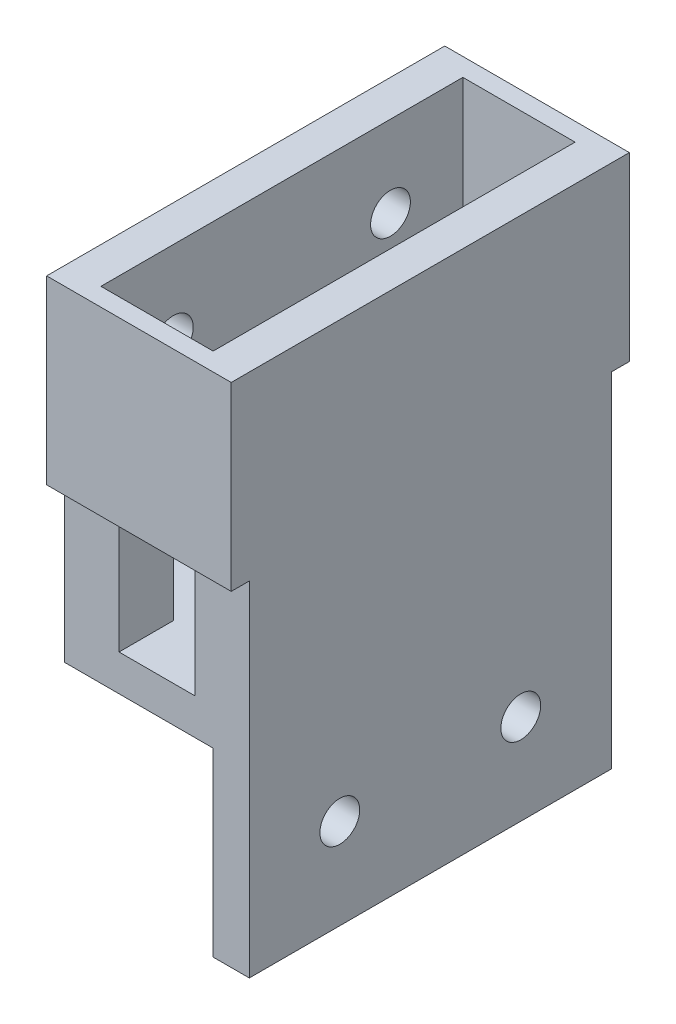
ISO-10303-21;
HEADER;
FILE_DESCRIPTION(('STEP AP214'),'2;1');
FILE_NAME('part.step','',(''),(''),'','','');
FILE_SCHEMA(('AUTOMOTIVE_DESIGN { 1 0 10303 214 1 1 1 1 }'));
ENDSEC;
DATA;
#1=APPLICATION_CONTEXT('core data for automotive mechanical design processes');
#2=APPLICATION_PROTOCOL_DEFINITION('international standard','automotive_design',2000,#1);
#3=PRODUCT_CONTEXT('',#1,'mechanical');
#4=PRODUCT('Part','Part','',(#3));
#5=PRODUCT_RELATED_PRODUCT_CATEGORY('part','',(#4));
#6=PRODUCT_DEFINITION_FORMATION('','',#4);
#7=PRODUCT_DEFINITION_CONTEXT('part definition',#1,'design');
#8=PRODUCT_DEFINITION('design','',#6,#7);
#9=PRODUCT_DEFINITION_SHAPE('','',#8);
#10=(LENGTH_UNIT() NAMED_UNIT(*) SI_UNIT(.MILLI.,.METRE.));
#11=(NAMED_UNIT(*) PLANE_ANGLE_UNIT() SI_UNIT($,.RADIAN.));
#12=(NAMED_UNIT(*) SI_UNIT($,.STERADIAN.) SOLID_ANGLE_UNIT());
#13=UNCERTAINTY_MEASURE_WITH_UNIT(LENGTH_MEASURE(1.E-05),#10,'distance_accuracy_value','');
#14=(GEOMETRIC_REPRESENTATION_CONTEXT(3) GLOBAL_UNCERTAINTY_ASSIGNED_CONTEXT((#13)) GLOBAL_UNIT_ASSIGNED_CONTEXT((#10,
#11,#12)) REPRESENTATION_CONTEXT('',''));
#15=CARTESIAN_POINT('',(0.,0.,0.));
#16=DIRECTION('',(0.,0.,1.));
#17=DIRECTION('',(1.,0.,0.));
#18=AXIS2_PLACEMENT_3D('',#15,#16,#17);
#19=CARTESIAN_POINT('',(0.,0.,20.));
#20=DIRECTION('',(0.,0.,1.));
#21=DIRECTION('',(1.,0.,0.));
#22=AXIS2_PLACEMENT_3D('',#19,#20,#21);
#23=PLANE('',#22);
#24=DIRECTION('',(0.,1.,0.));
#25=VECTOR('',#24,1.);
#26=CARTESIAN_POINT('',(10.2,-6.,20.));
#27=LINE('',#26,#25);
#28=CARTESIAN_POINT('',(10.2,-18.,20.));
#29=VERTEX_POINT('',#28);
#30=CARTESIAN_POINT('',(10.2,0.999999999999999,20.));
#31=VERTEX_POINT('',#30);
#32=EDGE_CURVE('E211',#29,#31,#27,.T.);
#33=ORIENTED_EDGE('',*,*,#32,.T.);
#34=DIRECTION('',(-1.,0.,0.));
#35=VECTOR('',#34,1.);
#36=CARTESIAN_POINT('',(10.2,0.999999999999999,20.));
#37=LINE('',#36,#35);
#38=CARTESIAN_POINT('',(7.2,0.999999999999999,20.));
#39=VERTEX_POINT('',#38);
#40=EDGE_CURVE('E48',#31,#39,#37,.T.);
#41=ORIENTED_EDGE('',*,*,#40,.T.);
#42=DIRECTION('',(0.,-1.,0.));
#43=VECTOR('',#42,1.);
#44=CARTESIAN_POINT('',(7.2,-6.,20.));
#45=LINE('',#44,#43);
#46=CARTESIAN_POINT('',(7.2,-6.,20.));
#47=VERTEX_POINT('',#46);
#48=EDGE_CURVE('E228',#39,#47,#45,.T.);
#49=ORIENTED_EDGE('',*,*,#48,.T.);
#50=DIRECTION('',(-1.,0.,0.));
#51=VECTOR('',#50,1.);
#52=CARTESIAN_POINT('',(3.,-6.,20.));
#53=LINE('',#52,#51);
#54=CARTESIAN_POINT('',(3.,-6.,20.));
#55=VERTEX_POINT('',#54);
#56=EDGE_CURVE('E231',#47,#55,#53,.T.);
#57=ORIENTED_EDGE('',*,*,#56,.T.);
#58=DIRECTION('',(0.,1.,0.));
#59=VECTOR('',#58,1.);
#60=CARTESIAN_POINT('',(3.,2.,20.));
#61=LINE('',#60,#59);
#62=CARTESIAN_POINT('',(3.,0.999999999999999,20.));
#63=VERTEX_POINT('',#62);
#64=EDGE_CURVE('E234',#55,#63,#61,.T.);
#65=ORIENTED_EDGE('',*,*,#64,.T.);
#66=CARTESIAN_POINT('',(0.,0.999999999999999,20.));
#67=VERTEX_POINT('',#66);
#68=EDGE_CURVE('E11',#63,#67,#37,.T.);
#69=ORIENTED_EDGE('',*,*,#68,.T.);
#70=DIRECTION('',(0.,-1.,0.));
#71=VECTOR('',#70,1.);
#72=CARTESIAN_POINT('',(0.,11.,20.));
#73=LINE('',#72,#71);
#74=CARTESIAN_POINT('',(0.,-8.,20.));
#75=VERTEX_POINT('',#74);
#76=EDGE_CURVE('E241',#67,#75,#73,.T.);
#77=ORIENTED_EDGE('',*,*,#76,.T.);
#78=DIRECTION('',(1.,0.,0.));
#79=VECTOR('',#78,1.);
#80=CARTESIAN_POINT('',(0.,-8.,20.));
#81=LINE('',#80,#79);
#82=CARTESIAN_POINT('',(8.2,-8.,20.));
#83=VERTEX_POINT('',#82);
#84=EDGE_CURVE('E280',#75,#83,#81,.T.);
#85=ORIENTED_EDGE('',*,*,#84,.T.);
#86=DIRECTION('',(0.,-1.,0.));
#87=VECTOR('',#86,1.);
#88=CARTESIAN_POINT('',(8.2,-18.,20.));
#89=LINE('',#88,#87);
#90=CARTESIAN_POINT('',(8.2,-18.,20.));
#91=VERTEX_POINT('',#90);
#92=EDGE_CURVE('E223',#83,#91,#89,.T.);
#93=ORIENTED_EDGE('',*,*,#92,.T.);
#94=DIRECTION('',(1.,0.,0.));
#95=VECTOR('',#94,1.);
#96=CARTESIAN_POINT('',(10.2,-18.,20.));
#97=LINE('',#96,#95);
#98=EDGE_CURVE('E217',#91,#29,#97,.T.);
#99=ORIENTED_EDGE('',*,*,#98,.T.);
#100=EDGE_LOOP('',(#33,#41,#49,#57,#65,#69,#77,#85,#93,#99));
#101=FACE_BOUND('',#100,.T.);
#102=ADVANCED_FACE('F37',(#101),#23,.T.);
#103=CARTESIAN_POINT('',(0.,-8.,20.));
#104=DIRECTION('',(0.,1.,0.));
#105=DIRECTION('',(0.,0.,1.));
#106=AXIS2_PLACEMENT_3D('',#103,#104,#105);
#107=PLANE('',#106);
#108=DIRECTION('',(1.,0.,0.));
#109=VECTOR('',#108,1.);
#110=CARTESIAN_POINT('',(0.,-8.,0.));
#111=LINE('',#110,#109);
#112=CARTESIAN_POINT('',(0.,-8.,0.));
#113=VERTEX_POINT('',#112);
#114=CARTESIAN_POINT('',(8.2,-8.,0.));
#115=VERTEX_POINT('',#114);
#116=EDGE_CURVE('E244',#113,#115,#111,.T.);
#117=ORIENTED_EDGE('',*,*,#116,.T.);
#118=DIRECTION('',(0.,0.,-1.));
#119=VECTOR('',#118,1.);
#120=CARTESIAN_POINT('',(8.2,-8.,20.));
#121=LINE('',#120,#119);
#122=EDGE_CURVE('E317',#83,#115,#121,.T.);
#123=ORIENTED_EDGE('',*,*,#122,.F.);
#124=ORIENTED_EDGE('',*,*,#84,.F.);
#125=DIRECTION('',(0.,0.,-1.));
#126=VECTOR('',#125,1.);
#127=CARTESIAN_POINT('',(0.,-8.,20.));
#128=LINE('',#127,#126);
#129=EDGE_CURVE('E243',#75,#113,#128,.T.);
#130=ORIENTED_EDGE('',*,*,#129,.T.);
#131=EDGE_LOOP('',(#117,#123,#124,#130));
#132=FACE_BOUND('',#131,.T.);
#133=ADVANCED_FACE('F39',(#132),#107,.F.);
#134=CARTESIAN_POINT('',(8.2,-18.,20.));
#135=DIRECTION('',(1.,0.,0.));
#136=DIRECTION('',(0.,0.,-1.));
#137=AXIS2_PLACEMENT_3D('',#134,#135,#136);
#138=PLANE('',#137);
#139=CARTESIAN_POINT('',(8.2,-13.,15.));
#140=DIRECTION('',(-1.,0.,0.));
#141=DIRECTION('',(0.,0.,1.));
#142=AXIS2_PLACEMENT_3D('',#139,#140,#141);
#143=CIRCLE('',#142,1.1);
#144=CARTESIAN_POINT('',(8.2,-13.,16.1));
#145=VERTEX_POINT('',#144);
#146=EDGE_CURVE('E333',#145,#145,#143,.T.);
#147=ORIENTED_EDGE('',*,*,#146,.F.);
#148=EDGE_LOOP('',(#147));
#149=FACE_BOUND('',#148,.T.);
#150=CARTESIAN_POINT('',(8.2,-13.,5.));
#151=DIRECTION('',(-1.,0.,0.));
#152=DIRECTION('',(0.,0.,1.));
#153=AXIS2_PLACEMENT_3D('',#150,#151,#152);
#154=CIRCLE('',#153,1.1);
#155=CARTESIAN_POINT('',(8.2,-13.,6.1));
#156=VERTEX_POINT('',#155);
#157=EDGE_CURVE('E322',#156,#156,#154,.T.);
#158=ORIENTED_EDGE('',*,*,#157,.F.);
#159=EDGE_LOOP('',(#158));
#160=FACE_BOUND('',#159,.T.);
#161=DIRECTION('',(0.,-1.,0.));
#162=VECTOR('',#161,1.);
#163=CARTESIAN_POINT('',(8.2,-18.,0.));
#164=LINE('',#163,#162);
#165=CARTESIAN_POINT('',(8.2,-18.,0.));
#166=VERTEX_POINT('',#165);
#167=EDGE_CURVE('E247',#115,#166,#164,.T.);
#168=ORIENTED_EDGE('',*,*,#167,.T.);
#169=DIRECTION('',(0.,0.,-1.));
#170=VECTOR('',#169,1.);
#171=CARTESIAN_POINT('',(8.2,-18.,20.));
#172=LINE('',#171,#170);
#173=EDGE_CURVE('E314',#91,#166,#172,.T.);
#174=ORIENTED_EDGE('',*,*,#173,.F.);
#175=ORIENTED_EDGE('',*,*,#92,.F.);
#176=ORIENTED_EDGE('',*,*,#122,.T.);
#177=EDGE_LOOP('',(#168,#174,#175,#176));
#178=FACE_BOUND('',#177,.T.);
#179=ADVANCED_FACE('F412',(#149,#160,#178),#138,.F.);
#180=CARTESIAN_POINT('',(10.2,-18.,20.));
#181=DIRECTION('',(0.,1.,0.));
#182=DIRECTION('',(0.,0.,1.));
#183=AXIS2_PLACEMENT_3D('',#180,#181,#182);
#184=PLANE('',#183);
#185=DIRECTION('',(1.,0.,0.));
#186=VECTOR('',#185,1.);
#187=CARTESIAN_POINT('',(10.2,-18.,0.));
#188=LINE('',#187,#186);
#189=CARTESIAN_POINT('',(10.2,-18.,0.));
#190=VERTEX_POINT('',#189);
#191=EDGE_CURVE('E250',#166,#190,#188,.T.);
#192=ORIENTED_EDGE('',*,*,#191,.T.);
#193=DIRECTION('',(0.,0.,-1.));
#194=VECTOR('',#193,1.);
#195=CARTESIAN_POINT('',(10.2,-18.,20.));
#196=LINE('',#195,#194);
#197=EDGE_CURVE('E312',#29,#190,#196,.T.);
#198=ORIENTED_EDGE('',*,*,#197,.F.);
#199=ORIENTED_EDGE('',*,*,#98,.F.);
#200=ORIENTED_EDGE('',*,*,#173,.T.);
#201=EDGE_LOOP('',(#192,#198,#199,#200));
#202=FACE_BOUND('',#201,.T.);
#203=ADVANCED_FACE('F415',(#202),#184,.F.);
#204=CARTESIAN_POINT('',(10.2,11.,20.));
#205=DIRECTION('',(-1.,0.,0.));
#206=DIRECTION('',(0.,-1.,0.));
#207=AXIS2_PLACEMENT_3D('',#204,#205,#206);
#208=PLANE('',#207);
#209=CARTESIAN_POINT('',(10.2,-13.,15.));
#210=DIRECTION('',(-1.,0.,0.));
#211=DIRECTION('',(0.,-1.,0.));
#212=AXIS2_PLACEMENT_3D('',#209,#210,#211);
#213=CIRCLE('',#212,1.1);
#214=CARTESIAN_POINT('',(10.2,-14.1,15.));
#215=VERTEX_POINT('',#214);
#216=EDGE_CURVE('E41',#215,#215,#213,.T.);
#217=ORIENTED_EDGE('',*,*,#216,.T.);
#218=EDGE_LOOP('',(#217));
#219=FACE_BOUND('',#218,.T.);
#220=CARTESIAN_POINT('',(10.2,-13.,5.));
#221=DIRECTION('',(-1.,0.,0.));
#222=DIRECTION('',(0.,-1.,0.));
#223=AXIS2_PLACEMENT_3D('',#220,#221,#222);
#224=CIRCLE('',#223,1.1);
#225=CARTESIAN_POINT('',(10.2,-14.1,5.));
#226=VERTEX_POINT('',#225);
#227=EDGE_CURVE('E319',#226,#226,#224,.T.);
#228=ORIENTED_EDGE('',*,*,#227,.T.);
#229=EDGE_LOOP('',(#228));
#230=FACE_BOUND('',#229,.T.);
#231=DIRECTION('',(0.,1.,0.));
#232=VECTOR('',#231,1.);
#233=CARTESIAN_POINT('',(10.2,11.,0.));
#234=LINE('',#233,#232);
#235=CARTESIAN_POINT('',(10.2,0.999999999999999,0.));
#236=VERTEX_POINT('',#235);
#237=EDGE_CURVE('E253',#190,#236,#234,.T.);
#238=ORIENTED_EDGE('',*,*,#237,.T.);
#239=DIRECTION('',(0.,0.,-1.));
#240=VECTOR('',#239,1.);
#241=CARTESIAN_POINT('',(10.2,0.999999999999999,0.));
#242=LINE('',#241,#240);
#243=CARTESIAN_POINT('',(10.2,0.999999999999999,-1.));
#244=VERTEX_POINT('',#243);
#245=EDGE_CURVE('E365',#236,#244,#242,.T.);
#246=ORIENTED_EDGE('',*,*,#245,.T.);
#247=DIRECTION('',(0.,1.,0.));
#248=VECTOR('',#247,1.);
#249=CARTESIAN_POINT('',(10.2,0.999999999999999,-1.));
#250=LINE('',#249,#248);
#251=CARTESIAN_POINT('',(10.2,11.,-1.));
#252=VERTEX_POINT('',#251);
#253=EDGE_CURVE('E371',#244,#252,#250,.T.);
#254=ORIENTED_EDGE('',*,*,#253,.T.);
#255=DIRECTION('',(0.,0.,-1.));
#256=VECTOR('',#255,1.);
#257=CARTESIAN_POINT('',(10.2,11.,20.));
#258=LINE('',#257,#256);
#259=CARTESIAN_POINT('',(10.2,11.,21.));
#260=VERTEX_POINT('',#259);
#261=EDGE_CURVE('E310',#260,#252,#258,.T.);
#262=ORIENTED_EDGE('',*,*,#261,.F.);
#263=DIRECTION('',(0.,1.,0.));
#264=VECTOR('',#263,1.);
#265=CARTESIAN_POINT('',(10.2,0.999999999999999,21.));
#266=LINE('',#265,#264);
#267=CARTESIAN_POINT('',(10.2,0.999999999999999,21.));
#268=VERTEX_POINT('',#267);
#269=EDGE_CURVE('E213',#268,#260,#266,.T.);
#270=ORIENTED_EDGE('',*,*,#269,.F.);
#271=DIRECTION('',(0.,0.,-1.));
#272=VECTOR('',#271,1.);
#273=CARTESIAN_POINT('',(10.2,0.999999999999999,21.));
#274=LINE('',#273,#272);
#275=EDGE_CURVE('E201',#268,#31,#274,.T.);
#276=ORIENTED_EDGE('',*,*,#275,.T.);
#277=ORIENTED_EDGE('',*,*,#32,.F.);
#278=ORIENTED_EDGE('',*,*,#197,.T.);
#279=EDGE_LOOP('',(#238,#246,#254,#262,#270,#276,#277,#278));
#280=FACE_BOUND('',#279,.T.);
#281=ADVANCED_FACE('F209',(#219,#230,#280),#208,.F.);
#282=CARTESIAN_POINT('',(8.2,2.,20.));
#283=DIRECTION('',(1.,0.,0.));
#284=DIRECTION('',(0.,0.,-1.));
#285=AXIS2_PLACEMENT_3D('',#282,#283,#284);
#286=PLANE('',#285);
#287=DIRECTION('',(0.,-1.,0.));
#288=VECTOR('',#287,1.);
#289=CARTESIAN_POINT('',(8.2,2.,0.));
#290=LINE('',#289,#288);
#291=CARTESIAN_POINT('',(8.2,11.,0.));
#292=VERTEX_POINT('',#291);
#293=CARTESIAN_POINT('',(8.2,2.,0.));
#294=VERTEX_POINT('',#293);
#295=EDGE_CURVE('E255',#292,#294,#290,.T.);
#296=ORIENTED_EDGE('',*,*,#295,.T.);
#297=DIRECTION('',(0.,0.,-1.));
#298=VECTOR('',#297,1.);
#299=CARTESIAN_POINT('',(8.2,2.,20.));
#300=LINE('',#299,#298);
#301=CARTESIAN_POINT('',(8.2,2.,20.));
#302=VERTEX_POINT('',#301);
#303=EDGE_CURVE('E304',#302,#294,#300,.T.);
#304=ORIENTED_EDGE('',*,*,#303,.F.);
#305=DIRECTION('',(0.,-1.,0.));
#306=VECTOR('',#305,1.);
#307=CARTESIAN_POINT('',(8.2,2.,20.));
#308=LINE('',#307,#306);
#309=CARTESIAN_POINT('',(8.2,11.,20.));
#310=VERTEX_POINT('',#309);
#311=EDGE_CURVE('E219',#310,#302,#308,.T.);
#312=ORIENTED_EDGE('',*,*,#311,.F.);
#313=DIRECTION('',(0.,0.,-1.));
#314=VECTOR('',#313,1.);
#315=CARTESIAN_POINT('',(8.2,11.,20.));
#316=LINE('',#315,#314);
#317=EDGE_CURVE('E307',#310,#292,#316,.T.);
#318=ORIENTED_EDGE('',*,*,#317,.T.);
#319=EDGE_LOOP('',(#296,#304,#312,#318));
#320=FACE_BOUND('',#319,.T.);
#321=ADVANCED_FACE('F461',(#320),#286,.F.);
#322=CARTESIAN_POINT('',(7.2,2.,20.));
#323=DIRECTION('',(0.,-1.,0.));
#324=DIRECTION('',(0.,0.,-1.));
#325=AXIS2_PLACEMENT_3D('',#322,#323,#324);
#326=PLANE('',#325);
#327=DIRECTION('',(-1.,0.,0.));
#328=VECTOR('',#327,1.);
#329=CARTESIAN_POINT('',(7.2,2.,0.));
#330=LINE('',#329,#328);
#331=CARTESIAN_POINT('',(7.2,2.,0.));
#332=VERTEX_POINT('',#331);
#333=EDGE_CURVE('E258',#294,#332,#330,.T.);
#334=ORIENTED_EDGE('',*,*,#333,.T.);
#335=DIRECTION('',(0.,0.,-1.));
#336=VECTOR('',#335,1.);
#337=CARTESIAN_POINT('',(7.2,2.,20.));
#338=LINE('',#337,#336);
#339=CARTESIAN_POINT('',(7.2,2.,20.));
#340=VERTEX_POINT('',#339);
#341=EDGE_CURVE('E301',#340,#332,#338,.T.);
#342=ORIENTED_EDGE('',*,*,#341,.F.);
#343=DIRECTION('',(-1.,0.,0.));
#344=VECTOR('',#343,1.);
#345=CARTESIAN_POINT('',(7.2,2.,20.));
#346=LINE('',#345,#344);
#347=EDGE_CURVE('E221',#302,#340,#346,.T.);
#348=ORIENTED_EDGE('',*,*,#347,.F.);
#349=ORIENTED_EDGE('',*,*,#303,.T.);
#350=EDGE_LOOP('',(#334,#342,#348,#349));
#351=FACE_BOUND('',#350,.T.);
#352=ADVANCED_FACE('F466',(#351),#326,.F.);
#353=CARTESIAN_POINT('',(7.2,-6.,20.));
#354=DIRECTION('',(1.,0.,0.));
#355=DIRECTION('',(0.,0.,-1.));
#356=AXIS2_PLACEMENT_3D('',#353,#354,#355);
#357=PLANE('',#356);
#358=DIRECTION('',(0.,-1.,0.));
#359=VECTOR('',#358,1.);
#360=CARTESIAN_POINT('',(7.2,-6.,0.));
#361=LINE('',#360,#359);
#362=CARTESIAN_POINT('',(7.2,0.999999999999999,0.));
#363=VERTEX_POINT('',#362);
#364=EDGE_CURVE('E262',#332,#363,#361,.T.);
#365=ORIENTED_EDGE('',*,*,#364,.T.);
#366=CARTESIAN_POINT('',(7.2,-6.,0.));
#367=VERTEX_POINT('',#366);
#368=EDGE_CURVE('E261',#363,#367,#361,.T.);
#369=ORIENTED_EDGE('',*,*,#368,.T.);
#370=DIRECTION('',(0.,0.,-1.));
#371=VECTOR('',#370,1.);
#372=CARTESIAN_POINT('',(7.2,-6.,20.));
#373=LINE('',#372,#371);
#374=EDGE_CURVE('E298',#47,#367,#373,.T.);
#375=ORIENTED_EDGE('',*,*,#374,.F.);
#376=ORIENTED_EDGE('',*,*,#48,.F.);
#377=EDGE_CURVE('E229',#340,#39,#45,.T.);
#378=ORIENTED_EDGE('',*,*,#377,.F.);
#379=ORIENTED_EDGE('',*,*,#341,.T.);
#380=EDGE_LOOP('',(#365,#369,#375,#376,#378,#379));
#381=FACE_BOUND('',#380,.T.);
#382=ADVANCED_FACE('F468',(#381),#357,.F.);
#383=CARTESIAN_POINT('',(3.,-6.,20.));
#384=DIRECTION('',(0.,-1.,0.));
#385=DIRECTION('',(0.,0.,-1.));
#386=AXIS2_PLACEMENT_3D('',#383,#384,#385);
#387=PLANE('',#386);
#388=DIRECTION('',(-1.,0.,0.));
#389=VECTOR('',#388,1.);
#390=CARTESIAN_POINT('',(3.,-6.,0.));
#391=LINE('',#390,#389);
#392=CARTESIAN_POINT('',(3.,-6.,0.));
#393=VERTEX_POINT('',#392);
#394=EDGE_CURVE('E265',#367,#393,#391,.T.);
#395=ORIENTED_EDGE('',*,*,#394,.T.);
#396=DIRECTION('',(0.,0.,-1.));
#397=VECTOR('',#396,1.);
#398=CARTESIAN_POINT('',(3.,-6.,20.));
#399=LINE('',#398,#397);
#400=CARTESIAN_POINT('',(3.,-6.,3.));
#401=VERTEX_POINT('',#400);
#402=EDGE_CURVE('E294',#401,#393,#399,.T.);
#403=ORIENTED_EDGE('',*,*,#402,.F.);
#404=DIRECTION('',(-1.,0.,0.));
#405=VECTOR('',#404,1.);
#406=CARTESIAN_POINT('',(17.560219778561,-6.,3.));
#407=LINE('',#406,#405);
#408=CARTESIAN_POINT('',(0.,-6.,3.));
#409=VERTEX_POINT('',#408);
#410=EDGE_CURVE('E399',#401,#409,#407,.T.);
#411=ORIENTED_EDGE('',*,*,#410,.T.);
#412=DIRECTION('',(0.,0.,1.));
#413=VECTOR('',#412,1.);
#414=CARTESIAN_POINT('',(0.,-6.,3.));
#415=LINE('',#414,#413);
#416=CARTESIAN_POINT('',(0.,-6.,17.));
#417=VERTEX_POINT('',#416);
#418=EDGE_CURVE('E390',#409,#417,#415,.T.);
#419=ORIENTED_EDGE('',*,*,#418,.T.);
#420=DIRECTION('',(-1.,0.,0.));
#421=VECTOR('',#420,1.);
#422=CARTESIAN_POINT('',(17.560219778561,-6.,17.));
#423=LINE('',#422,#421);
#424=CARTESIAN_POINT('',(3.,-6.,17.));
#425=VERTEX_POINT('',#424);
#426=EDGE_CURVE('E403',#425,#417,#423,.T.);
#427=ORIENTED_EDGE('',*,*,#426,.F.);
#428=EDGE_CURVE('E295',#55,#425,#399,.T.);
#429=ORIENTED_EDGE('',*,*,#428,.F.);
#430=ORIENTED_EDGE('',*,*,#56,.F.);
#431=ORIENTED_EDGE('',*,*,#374,.T.);
#432=EDGE_LOOP('',(#395,#403,#411,#419,#427,#429,#430,#431));
#433=FACE_BOUND('',#432,.T.);
#434=ADVANCED_FACE('F473',(#433),#387,.F.);
#435=CARTESIAN_POINT('',(3.,2.,20.));
#436=DIRECTION('',(-1.,0.,0.));
#437=DIRECTION('',(0.,0.,1.));
#438=AXIS2_PLACEMENT_3D('',#435,#436,#437);
#439=PLANE('',#438);
#440=DIRECTION('',(0.,0.,1.));
#441=VECTOR('',#440,1.);
#442=CARTESIAN_POINT('',(3.,-2.,3.));
#443=LINE('',#442,#441);
#444=CARTESIAN_POINT('',(3.,-2.,3.));
#445=VERTEX_POINT('',#444);
#446=CARTESIAN_POINT('',(3.,-2.,17.));
#447=VERTEX_POINT('',#446);
#448=EDGE_CURVE('E385',#445,#447,#443,.T.);
#449=ORIENTED_EDGE('',*,*,#448,.F.);
#450=DIRECTION('',(0.,1.,0.));
#451=VECTOR('',#450,1.);
#452=CARTESIAN_POINT('',(3.,-6.,3.));
#453=LINE('',#452,#451);
#454=EDGE_CURVE('E248',#401,#445,#453,.T.);
#455=ORIENTED_EDGE('',*,*,#454,.F.);
#456=ORIENTED_EDGE('',*,*,#402,.T.);
#457=DIRECTION('',(0.,1.,0.));
#458=VECTOR('',#457,1.);
#459=CARTESIAN_POINT('',(3.,2.,0.));
#460=LINE('',#459,#458);
#461=CARTESIAN_POINT('',(3.,0.999999999999999,0.));
#462=VERTEX_POINT('',#461);
#463=EDGE_CURVE('E269',#393,#462,#460,.T.);
#464=ORIENTED_EDGE('',*,*,#463,.T.);
#465=CARTESIAN_POINT('',(3.,2.,0.));
#466=VERTEX_POINT('',#465);
#467=EDGE_CURVE('E268',#462,#466,#460,.T.);
#468=ORIENTED_EDGE('',*,*,#467,.T.);
#469=DIRECTION('',(0.,0.,-1.));
#470=VECTOR('',#469,1.);
#471=CARTESIAN_POINT('',(3.,2.,20.));
#472=LINE('',#471,#470);
#473=CARTESIAN_POINT('',(3.,2.,20.));
#474=VERTEX_POINT('',#473);
#475=EDGE_CURVE('E291',#474,#466,#472,.T.);
#476=ORIENTED_EDGE('',*,*,#475,.F.);
#477=EDGE_CURVE('E233',#63,#474,#61,.T.);
#478=ORIENTED_EDGE('',*,*,#477,.F.);
#479=ORIENTED_EDGE('',*,*,#64,.F.);
#480=ORIENTED_EDGE('',*,*,#428,.T.);
#481=DIRECTION('',(0.,-1.,0.));
#482=VECTOR('',#481,1.);
#483=CARTESIAN_POINT('',(3.,-6.,17.));
#484=LINE('',#483,#482);
#485=EDGE_CURVE('E382',#447,#425,#484,.T.);
#486=ORIENTED_EDGE('',*,*,#485,.F.);
#487=EDGE_LOOP('',(#449,#455,#456,#464,#468,#476,#478,#479,#480,#486));
#488=FACE_BOUND('',#487,.T.);
#489=ADVANCED_FACE('F446',(#488),#439,.F.);
#490=CARTESIAN_POINT('',(2.,2.,20.));
#491=DIRECTION('',(0.,-1.,0.));
#492=DIRECTION('',(0.,0.,-1.));
#493=AXIS2_PLACEMENT_3D('',#490,#491,#492);
#494=PLANE('',#493);
#495=DIRECTION('',(-1.,0.,0.));
#496=VECTOR('',#495,1.);
#497=CARTESIAN_POINT('',(2.,2.,0.));
#498=LINE('',#497,#496);
#499=CARTESIAN_POINT('',(2.,2.,0.));
#500=VERTEX_POINT('',#499);
#501=EDGE_CURVE('E272',#466,#500,#498,.T.);
#502=ORIENTED_EDGE('',*,*,#501,.T.);
#503=DIRECTION('',(0.,0.,-1.));
#504=VECTOR('',#503,1.);
#505=CARTESIAN_POINT('',(2.,2.,20.));
#506=LINE('',#505,#504);
#507=CARTESIAN_POINT('',(2.,2.,20.));
#508=VERTEX_POINT('',#507);
#509=EDGE_CURVE('E288',#508,#500,#506,.T.);
#510=ORIENTED_EDGE('',*,*,#509,.F.);
#511=DIRECTION('',(-1.,0.,0.));
#512=VECTOR('',#511,1.);
#513=CARTESIAN_POINT('',(2.,2.,20.));
#514=LINE('',#513,#512);
#515=EDGE_CURVE('E237',#474,#508,#514,.T.);
#516=ORIENTED_EDGE('',*,*,#515,.F.);
#517=ORIENTED_EDGE('',*,*,#475,.T.);
#518=EDGE_LOOP('',(#502,#510,#516,#517));
#519=FACE_BOUND('',#518,.T.);
#520=ADVANCED_FACE('F450',(#519),#494,.F.);
#521=CARTESIAN_POINT('',(2.,11.,20.));
#522=DIRECTION('',(-1.,0.,0.));
#523=DIRECTION('',(0.,-1.,0.));
#524=AXIS2_PLACEMENT_3D('',#521,#522,#523);
#525=PLANE('',#524);
#526=CARTESIAN_POINT('',(2.,6.5,16.));
#527=DIRECTION('',(-1.,0.,0.));
#528=DIRECTION('',(0.,-1.,0.));
#529=AXIS2_PLACEMENT_3D('',#526,#527,#528);
#530=CIRCLE('',#529,1.1);
#531=CARTESIAN_POINT('',(2.,5.4,16.));
#532=VERTEX_POINT('',#531);
#533=EDGE_CURVE('E326',#532,#532,#530,.T.);
#534=ORIENTED_EDGE('',*,*,#533,.T.);
#535=EDGE_LOOP('',(#534));
#536=FACE_BOUND('',#535,.T.);
#537=CARTESIAN_POINT('',(2.,6.5,4.));
#538=DIRECTION('',(-1.,0.,0.));
#539=DIRECTION('',(0.,-1.,0.));
#540=AXIS2_PLACEMENT_3D('',#537,#538,#539);
#541=CIRCLE('',#540,1.1);
#542=CARTESIAN_POINT('',(2.,5.4,4.));
#543=VERTEX_POINT('',#542);
#544=EDGE_CURVE('E341',#543,#543,#541,.T.);
#545=ORIENTED_EDGE('',*,*,#544,.T.);
#546=EDGE_LOOP('',(#545));
#547=FACE_BOUND('',#546,.T.);
#548=DIRECTION('',(0.,1.,0.));
#549=VECTOR('',#548,1.);
#550=CARTESIAN_POINT('',(2.,11.,0.));
#551=LINE('',#550,#549);
#552=CARTESIAN_POINT('',(2.,11.,0.));
#553=VERTEX_POINT('',#552);
#554=EDGE_CURVE('E275',#500,#553,#551,.T.);
#555=ORIENTED_EDGE('',*,*,#554,.T.);
#556=DIRECTION('',(0.,0.,-1.));
#557=VECTOR('',#556,1.);
#558=CARTESIAN_POINT('',(2.,11.,20.));
#559=LINE('',#558,#557);
#560=CARTESIAN_POINT('',(2.,11.,20.));
#561=VERTEX_POINT('',#560);
#562=EDGE_CURVE('E285',#561,#553,#559,.T.);
#563=ORIENTED_EDGE('',*,*,#562,.F.);
#564=DIRECTION('',(0.,1.,0.));
#565=VECTOR('',#564,1.);
#566=CARTESIAN_POINT('',(2.,11.,20.));
#567=LINE('',#566,#565);
#568=EDGE_CURVE('E239',#508,#561,#567,.T.);
#569=ORIENTED_EDGE('',*,*,#568,.F.);
#570=ORIENTED_EDGE('',*,*,#509,.T.);
#571=EDGE_LOOP('',(#555,#563,#569,#570));
#572=FACE_BOUND('',#571,.T.);
#573=ADVANCED_FACE('F459',(#536,#547,#572),#525,.F.);
#574=CARTESIAN_POINT('',(0.,11.,20.));
#575=DIRECTION('',(0.,-1.,0.));
#576=DIRECTION('',(0.,0.,-1.));
#577=AXIS2_PLACEMENT_3D('',#574,#575,#576);
#578=PLANE('',#577);
#579=ORIENTED_EDGE('',*,*,#317,.F.);
#580=DIRECTION('',(-1.,0.,0.));
#581=VECTOR('',#580,1.);
#582=CARTESIAN_POINT('',(10.2,11.,20.));
#583=LINE('',#582,#581);
#584=EDGE_CURVE('E343',#310,#561,#583,.T.);
#585=ORIENTED_EDGE('',*,*,#584,.T.);
#586=ORIENTED_EDGE('',*,*,#562,.T.);
#587=DIRECTION('',(1.,0.,0.));
#588=VECTOR('',#587,1.);
#589=CARTESIAN_POINT('',(0.,11.,0.));
#590=LINE('',#589,#588);
#591=EDGE_CURVE('E354',#553,#292,#590,.T.);
#592=ORIENTED_EDGE('',*,*,#591,.T.);
#593=EDGE_LOOP('',(#579,#585,#586,#592));
#594=FACE_BOUND('',#593,.T.);
#595=DIRECTION('',(1.,0.,0.));
#596=VECTOR('',#595,1.);
#597=CARTESIAN_POINT('',(0.,11.,21.));
#598=LINE('',#597,#596);
#599=CARTESIAN_POINT('',(0.,11.,21.));
#600=VERTEX_POINT('',#599);
#601=EDGE_CURVE('E214',#600,#260,#598,.T.);
#602=ORIENTED_EDGE('',*,*,#601,.T.);
#603=ORIENTED_EDGE('',*,*,#261,.T.);
#604=DIRECTION('',(-1.,0.,0.));
#605=VECTOR('',#604,1.);
#606=CARTESIAN_POINT('',(10.2,11.,-1.));
#607=LINE('',#606,#605);
#608=CARTESIAN_POINT('',(0.,11.,-1.));
#609=VERTEX_POINT('',#608);
#610=EDGE_CURVE('E361',#252,#609,#607,.T.);
#611=ORIENTED_EDGE('',*,*,#610,.T.);
#612=DIRECTION('',(0.,0.,-1.));
#613=VECTOR('',#612,1.);
#614=CARTESIAN_POINT('',(0.,11.,20.));
#615=LINE('',#614,#613);
#616=EDGE_CURVE('E283',#600,#609,#615,.T.);
#617=ORIENTED_EDGE('',*,*,#616,.F.);
#618=EDGE_LOOP('',(#602,#603,#611,#617));
#619=FACE_BOUND('',#618,.T.);
#620=ADVANCED_FACE('F456',(#594,#619),#578,.F.);
#621=CARTESIAN_POINT('',(0.,11.,20.));
#622=DIRECTION('',(1.,0.,0.));
#623=DIRECTION('',(0.,1.,0.));
#624=AXIS2_PLACEMENT_3D('',#621,#622,#623);
#625=PLANE('',#624);
#626=CARTESIAN_POINT('',(0.,6.5,16.));
#627=DIRECTION('',(-1.,0.,0.));
#628=DIRECTION('',(0.,-1.,0.));
#629=AXIS2_PLACEMENT_3D('',#626,#627,#628);
#630=CIRCLE('',#629,1.1);
#631=CARTESIAN_POINT('',(0.,5.4,16.));
#632=VERTEX_POINT('',#631);
#633=EDGE_CURVE('E321',#632,#632,#630,.T.);
#634=ORIENTED_EDGE('',*,*,#633,.F.);
#635=EDGE_LOOP('',(#634));
#636=FACE_BOUND('',#635,.T.);
#637=CARTESIAN_POINT('',(0.,6.5,4.));
#638=DIRECTION('',(-1.,0.,0.));
#639=DIRECTION('',(0.,-1.,0.));
#640=AXIS2_PLACEMENT_3D('',#637,#638,#639);
#641=CIRCLE('',#640,1.1);
#642=CARTESIAN_POINT('',(0.,5.4,4.));
#643=VERTEX_POINT('',#642);
#644=EDGE_CURVE('E338',#643,#643,#641,.T.);
#645=ORIENTED_EDGE('',*,*,#644,.F.);
#646=EDGE_LOOP('',(#645));
#647=FACE_BOUND('',#646,.T.);
#648=ORIENTED_EDGE('',*,*,#418,.F.);
#649=DIRECTION('',(0.,-1.,0.));
#650=VECTOR('',#649,1.);
#651=CARTESIAN_POINT('',(0.,-6.,3.));
#652=LINE('',#651,#650);
#653=CARTESIAN_POINT('',(0.,-2.,3.));
#654=VERTEX_POINT('',#653);
#655=EDGE_CURVE('E379',#654,#409,#652,.T.);
#656=ORIENTED_EDGE('',*,*,#655,.F.);
#657=DIRECTION('',(0.,0.,-1.));
#658=VECTOR('',#657,1.);
#659=CARTESIAN_POINT('',(0.,-2.,3.));
#660=LINE('',#659,#658);
#661=CARTESIAN_POINT('',(0.,-2.,17.));
#662=VERTEX_POINT('',#661);
#663=EDGE_CURVE('E396',#662,#654,#660,.T.);
#664=ORIENTED_EDGE('',*,*,#663,.F.);
#665=DIRECTION('',(0.,1.,0.));
#666=VECTOR('',#665,1.);
#667=CARTESIAN_POINT('',(0.,-6.,17.));
#668=LINE('',#667,#666);
#669=EDGE_CURVE('E393',#417,#662,#668,.T.);
#670=ORIENTED_EDGE('',*,*,#669,.F.);
#671=EDGE_LOOP('',(#648,#656,#664,#670));
#672=FACE_BOUND('',#671,.T.);
#673=ORIENTED_EDGE('',*,*,#616,.T.);
#674=DIRECTION('',(0.,1.,0.));
#675=VECTOR('',#674,1.);
#676=CARTESIAN_POINT('',(0.,0.999999999999999,-1.));
#677=LINE('',#676,#675);
#678=CARTESIAN_POINT('',(0.,0.999999999999999,-1.));
#679=VERTEX_POINT('',#678);
#680=EDGE_CURVE('E376',#679,#609,#677,.T.);
#681=ORIENTED_EDGE('',*,*,#680,.F.);
#682=DIRECTION('',(0.,0.,1.));
#683=VECTOR('',#682,1.);
#684=CARTESIAN_POINT('',(0.,0.999999999999999,-1.));
#685=LINE('',#684,#683);
#686=CARTESIAN_POINT('',(0.,0.999999999999999,0.));
#687=VERTEX_POINT('',#686);
#688=EDGE_CURVE('E357',#679,#687,#685,.T.);
#689=ORIENTED_EDGE('',*,*,#688,.T.);
#690=DIRECTION('',(0.,-1.,0.));
#691=VECTOR('',#690,1.);
#692=CARTESIAN_POINT('',(0.,11.,0.));
#693=LINE('',#692,#691);
#694=EDGE_CURVE('E278',#687,#113,#693,.T.);
#695=ORIENTED_EDGE('',*,*,#694,.T.);
#696=ORIENTED_EDGE('',*,*,#129,.F.);
#697=ORIENTED_EDGE('',*,*,#76,.F.);
#698=DIRECTION('',(0.,0.,1.));
#699=VECTOR('',#698,1.);
#700=CARTESIAN_POINT('',(0.,0.999999999999999,20.));
#701=LINE('',#700,#699);
#702=CARTESIAN_POINT('',(0.,0.999999999999999,21.));
#703=VERTEX_POINT('',#702);
#704=EDGE_CURVE('E56',#67,#703,#701,.T.);
#705=ORIENTED_EDGE('',*,*,#704,.T.);
#706=DIRECTION('',(0.,1.,0.));
#707=VECTOR('',#706,1.);
#708=CARTESIAN_POINT('',(0.,0.999999999999999,21.));
#709=LINE('',#708,#707);
#710=EDGE_CURVE('E348',#703,#600,#709,.T.);
#711=ORIENTED_EDGE('',*,*,#710,.T.);
#712=EDGE_LOOP('',(#673,#681,#689,#695,#696,#697,#705,#711));
#713=FACE_BOUND('',#712,.T.);
#714=ADVANCED_FACE('F433',(#636,#647,#672,#713),#625,.F.);
#715=CARTESIAN_POINT('',(0.,0.,0.));
#716=DIRECTION('',(0.,0.,1.));
#717=DIRECTION('',(1.,0.,0.));
#718=AXIS2_PLACEMENT_3D('',#715,#716,#717);
#719=PLANE('',#718);
#720=ORIENTED_EDGE('',*,*,#694,.F.);
#721=DIRECTION('',(1.,0.,0.));
#722=VECTOR('',#721,1.);
#723=CARTESIAN_POINT('',(0.,0.999999999999999,0.));
#724=LINE('',#723,#722);
#725=EDGE_CURVE('E362',#687,#462,#724,.T.);
#726=ORIENTED_EDGE('',*,*,#725,.T.);
#727=ORIENTED_EDGE('',*,*,#463,.F.);
#728=ORIENTED_EDGE('',*,*,#394,.F.);
#729=ORIENTED_EDGE('',*,*,#368,.F.);
#730=EDGE_CURVE('E46',#363,#236,#724,.T.);
#731=ORIENTED_EDGE('',*,*,#730,.T.);
#732=ORIENTED_EDGE('',*,*,#237,.F.);
#733=ORIENTED_EDGE('',*,*,#191,.F.);
#734=ORIENTED_EDGE('',*,*,#167,.F.);
#735=ORIENTED_EDGE('',*,*,#116,.F.);
#736=EDGE_LOOP('',(#720,#726,#727,#728,#729,#731,#732,#733,#734,#735));
#737=FACE_BOUND('',#736,.T.);
#738=ADVANCED_FACE('F420',(#737),#719,.F.);
#739=CARTESIAN_POINT('',(17.560219778561,-6.,3.));
#740=DIRECTION('',(0.,0.,-1.));
#741=DIRECTION('',(-1.,0.,0.));
#742=AXIS2_PLACEMENT_3D('',#739,#740,#741);
#743=PLANE('',#742);
#744=ORIENTED_EDGE('',*,*,#454,.T.);
#745=DIRECTION('',(-1.,0.,0.));
#746=VECTOR('',#745,1.);
#747=CARTESIAN_POINT('',(17.560219778561,-2.,3.));
#748=LINE('',#747,#746);
#749=EDGE_CURVE('E386',#445,#654,#748,.T.);
#750=ORIENTED_EDGE('',*,*,#749,.T.);
#751=ORIENTED_EDGE('',*,*,#655,.T.);
#752=ORIENTED_EDGE('',*,*,#410,.F.);
#753=EDGE_LOOP('',(#744,#750,#751,#752));
#754=FACE_BOUND('',#753,.T.);
#755=ADVANCED_FACE('F486',(#754),#743,.F.);
#756=CARTESIAN_POINT('',(17.560219778561,-2.,3.));
#757=DIRECTION('',(0.,1.,0.));
#758=DIRECTION('',(0.,0.,1.));
#759=AXIS2_PLACEMENT_3D('',#756,#757,#758);
#760=PLANE('',#759);
#761=ORIENTED_EDGE('',*,*,#448,.T.);
#762=DIRECTION('',(-1.,0.,0.));
#763=VECTOR('',#762,1.);
#764=CARTESIAN_POINT('',(17.560219778561,-2.,17.));
#765=LINE('',#764,#763);
#766=EDGE_CURVE('E401',#447,#662,#765,.T.);
#767=ORIENTED_EDGE('',*,*,#766,.T.);
#768=ORIENTED_EDGE('',*,*,#663,.T.);
#769=ORIENTED_EDGE('',*,*,#749,.F.);
#770=EDGE_LOOP('',(#761,#767,#768,#769));
#771=FACE_BOUND('',#770,.T.);
#772=ADVANCED_FACE('F482',(#771),#760,.F.);
#773=CARTESIAN_POINT('',(17.560219778561,-6.,17.));
#774=DIRECTION('',(0.,0.,1.));
#775=DIRECTION('',(1.,0.,0.));
#776=AXIS2_PLACEMENT_3D('',#773,#774,#775);
#777=PLANE('',#776);
#778=ORIENTED_EDGE('',*,*,#485,.T.);
#779=ORIENTED_EDGE('',*,*,#426,.T.);
#780=ORIENTED_EDGE('',*,*,#669,.T.);
#781=ORIENTED_EDGE('',*,*,#766,.F.);
#782=EDGE_LOOP('',(#778,#779,#780,#781));
#783=FACE_BOUND('',#782,.T.);
#784=ADVANCED_FACE('F478',(#783),#777,.F.);
#785=CARTESIAN_POINT('',(0.,0.999999999999999,0.));
#786=DIRECTION('',(0.,0.,1.));
#787=DIRECTION('',(1.,0.,0.));
#788=AXIS2_PLACEMENT_3D('',#785,#786,#787);
#789=PLANE('',#788);
#790=ORIENTED_EDGE('',*,*,#554,.F.);
#791=ORIENTED_EDGE('',*,*,#501,.F.);
#792=ORIENTED_EDGE('',*,*,#467,.F.);
#793=EDGE_CURVE('E360',#462,#363,#724,.T.);
#794=ORIENTED_EDGE('',*,*,#793,.T.);
#795=ORIENTED_EDGE('',*,*,#364,.F.);
#796=ORIENTED_EDGE('',*,*,#333,.F.);
#797=ORIENTED_EDGE('',*,*,#295,.F.);
#798=ORIENTED_EDGE('',*,*,#591,.F.);
#799=EDGE_LOOP('',(#790,#791,#792,#794,#795,#796,#797,#798));
#800=FACE_BOUND('',#799,.T.);
#801=ADVANCED_FACE('F427',(#800),#789,.T.);
#802=CARTESIAN_POINT('',(10.2,0.999999999999999,-1.));
#803=DIRECTION('',(0.,0.,-1.));
#804=DIRECTION('',(-1.,0.,0.));
#805=AXIS2_PLACEMENT_3D('',#802,#803,#804);
#806=PLANE('',#805);
#807=ORIENTED_EDGE('',*,*,#610,.F.);
#808=ORIENTED_EDGE('',*,*,#253,.F.);
#809=DIRECTION('',(-1.,0.,0.));
#810=VECTOR('',#809,1.);
#811=CARTESIAN_POINT('',(10.2,0.999999999999999,-1.));
#812=LINE('',#811,#810);
#813=EDGE_CURVE('E368',#244,#679,#812,.T.);
#814=ORIENTED_EDGE('',*,*,#813,.T.);
#815=ORIENTED_EDGE('',*,*,#680,.T.);
#816=EDGE_LOOP('',(#807,#808,#814,#815));
#817=FACE_BOUND('',#816,.T.);
#818=ADVANCED_FACE('F515',(#817),#806,.T.);
#819=CARTESIAN_POINT('',(0.,0.999999999999999,0.));
#820=DIRECTION('',(0.,1.,0.));
#821=DIRECTION('',(0.,0.,1.));
#822=AXIS2_PLACEMENT_3D('',#819,#820,#821);
#823=PLANE('',#822);
#824=ORIENTED_EDGE('',*,*,#688,.F.);
#825=ORIENTED_EDGE('',*,*,#813,.F.);
#826=ORIENTED_EDGE('',*,*,#245,.F.);
#827=ORIENTED_EDGE('',*,*,#730,.F.);
#828=ORIENTED_EDGE('',*,*,#793,.F.);
#829=ORIENTED_EDGE('',*,*,#725,.F.);
#830=EDGE_LOOP('',(#824,#825,#826,#827,#828,#829));
#831=FACE_BOUND('',#830,.T.);
#832=ADVANCED_FACE('F430',(#831),#823,.F.);
#833=CARTESIAN_POINT('',(0.,0.999999999999999,21.));
#834=DIRECTION('',(0.,0.,1.));
#835=DIRECTION('',(1.,0.,0.));
#836=AXIS2_PLACEMENT_3D('',#833,#834,#835);
#837=PLANE('',#836);
#838=ORIENTED_EDGE('',*,*,#601,.F.);
#839=ORIENTED_EDGE('',*,*,#710,.F.);
#840=DIRECTION('',(1.,0.,0.));
#841=VECTOR('',#840,1.);
#842=CARTESIAN_POINT('',(0.,0.999999999999999,21.));
#843=LINE('',#842,#841);
#844=EDGE_CURVE('E346',#703,#268,#843,.T.);
#845=ORIENTED_EDGE('',*,*,#844,.T.);
#846=ORIENTED_EDGE('',*,*,#269,.T.);
#847=EDGE_LOOP('',(#838,#839,#845,#846));
#848=FACE_BOUND('',#847,.T.);
#849=ADVANCED_FACE('F521',(#848),#837,.T.);
#850=CARTESIAN_POINT('',(10.2,0.999999999999999,20.));
#851=DIRECTION('',(0.,0.,-1.));
#852=DIRECTION('',(-1.,0.,0.));
#853=AXIS2_PLACEMENT_3D('',#850,#851,#852);
#854=PLANE('',#853);
#855=ORIENTED_EDGE('',*,*,#584,.F.);
#856=ORIENTED_EDGE('',*,*,#311,.T.);
#857=ORIENTED_EDGE('',*,*,#347,.T.);
#858=ORIENTED_EDGE('',*,*,#377,.T.);
#859=EDGE_CURVE('E49',#39,#63,#37,.T.);
#860=ORIENTED_EDGE('',*,*,#859,.T.);
#861=ORIENTED_EDGE('',*,*,#477,.T.);
#862=ORIENTED_EDGE('',*,*,#515,.T.);
#863=ORIENTED_EDGE('',*,*,#568,.T.);
#864=EDGE_LOOP('',(#855,#856,#857,#858,#860,#861,#862,#863));
#865=FACE_BOUND('',#864,.T.);
#866=ADVANCED_FACE('F441',(#865),#854,.T.);
#867=CARTESIAN_POINT('',(0.,0.999999999999999,0.));
#868=DIRECTION('',(0.,1.,0.));
#869=DIRECTION('',(0.,0.,1.));
#870=AXIS2_PLACEMENT_3D('',#867,#868,#869);
#871=PLANE('',#870);
#872=ORIENTED_EDGE('',*,*,#275,.F.);
#873=ORIENTED_EDGE('',*,*,#844,.F.);
#874=ORIENTED_EDGE('',*,*,#704,.F.);
#875=ORIENTED_EDGE('',*,*,#68,.F.);
#876=ORIENTED_EDGE('',*,*,#859,.F.);
#877=ORIENTED_EDGE('',*,*,#40,.F.);
#878=EDGE_LOOP('',(#872,#873,#874,#875,#876,#877));
#879=FACE_BOUND('',#878,.T.);
#880=ADVANCED_FACE('F200',(#879),#871,.F.);
#881=CARTESIAN_POINT('',(5.,6.5,4.));
#882=DIRECTION('',(-1.,0.,0.));
#883=DIRECTION('',(0.,-1.,0.));
#884=AXIS2_PLACEMENT_3D('',#881,#882,#883);
#885=CYLINDRICAL_SURFACE('',#884,1.1);
#886=ORIENTED_EDGE('',*,*,#644,.T.);
#887=EDGE_LOOP('',(#886));
#888=FACE_BOUND('',#887,.T.);
#889=ORIENTED_EDGE('',*,*,#544,.F.);
#890=EDGE_LOOP('',(#889));
#891=FACE_BOUND('',#890,.T.);
#892=ADVANCED_FACE('F529',(#888,#891),#885,.F.);
#893=CARTESIAN_POINT('',(5.,6.5,16.));
#894=DIRECTION('',(-1.,0.,0.));
#895=DIRECTION('',(0.,-1.,0.));
#896=AXIS2_PLACEMENT_3D('',#893,#894,#895);
#897=CYLINDRICAL_SURFACE('',#896,1.1);
#898=ORIENTED_EDGE('',*,*,#633,.T.);
#899=EDGE_LOOP('',(#898));
#900=FACE_BOUND('',#899,.T.);
#901=ORIENTED_EDGE('',*,*,#533,.F.);
#902=EDGE_LOOP('',(#901));
#903=FACE_BOUND('',#902,.T.);
#904=ADVANCED_FACE('F532',(#900,#903),#897,.F.);
#905=CARTESIAN_POINT('',(13.2,-13.,5.));
#906=DIRECTION('',(-1.,0.,0.));
#907=DIRECTION('',(0.,0.,1.));
#908=AXIS2_PLACEMENT_3D('',#905,#906,#907);
#909=CYLINDRICAL_SURFACE('',#908,1.1);
#910=ORIENTED_EDGE('',*,*,#157,.T.);
#911=EDGE_LOOP('',(#910));
#912=FACE_BOUND('',#911,.T.);
#913=ORIENTED_EDGE('',*,*,#227,.F.);
#914=EDGE_LOOP('',(#913));
#915=FACE_BOUND('',#914,.T.);
#916=ADVANCED_FACE('F536',(#912,#915),#909,.F.);
#917=CARTESIAN_POINT('',(13.2,-13.,15.));
#918=DIRECTION('',(-1.,0.,0.));
#919=DIRECTION('',(0.,0.,1.));
#920=AXIS2_PLACEMENT_3D('',#917,#918,#919);
#921=CYLINDRICAL_SURFACE('',#920,1.1);
#922=ORIENTED_EDGE('',*,*,#146,.T.);
#923=EDGE_LOOP('',(#922));
#924=FACE_BOUND('',#923,.T.);
#925=ORIENTED_EDGE('',*,*,#216,.F.);
#926=EDGE_LOOP('',(#925));
#927=FACE_BOUND('',#926,.T.);
#928=ADVANCED_FACE('F540',(#924,#927),#921,.F.);
#929=CLOSED_SHELL('',(#102,#133,#179,#203,#281,#321,#352,#382,#434,#489,#520,#573,#620,#714,
#738,#755,#772,#784,#801,#818,#832,#849,#866,#880,#892,#904,#916,#928));
#930=MANIFOLD_SOLID_BREP('B2',#929);
#931=ADVANCED_BREP_SHAPE_REPRESENTATION('',(#18,#930),#14);
#932=SHAPE_DEFINITION_REPRESENTATION(#9,#931);
ENDSEC;
END-ISO-10303-21;
